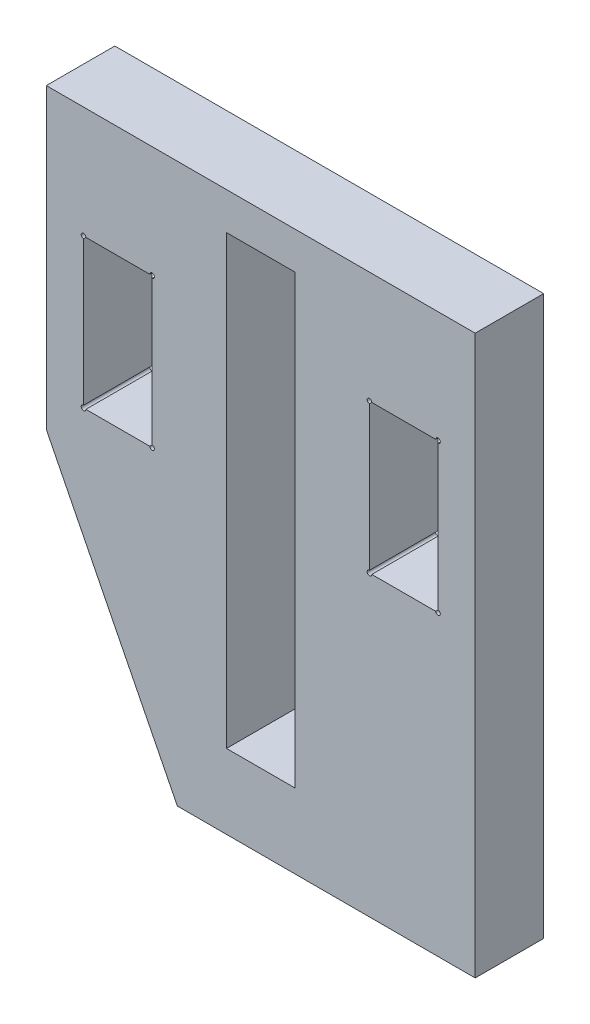
ISO-10303-21;
HEADER;
FILE_DESCRIPTION(('STEP AP214'),'2;1');
FILE_NAME('part.step','',(''),(''),'','','');
FILE_SCHEMA(('AUTOMOTIVE_DESIGN { 1 0 10303 214 1 1 1 1 }'));
ENDSEC;
DATA;
#1=APPLICATION_CONTEXT('core data for automotive mechanical design processes');
#2=APPLICATION_PROTOCOL_DEFINITION('international standard','automotive_design',2000,#1);
#3=PRODUCT_CONTEXT('',#1,'mechanical');
#4=PRODUCT('Part','Part','',(#3));
#5=PRODUCT_RELATED_PRODUCT_CATEGORY('part','',(#4));
#6=PRODUCT_DEFINITION_FORMATION('','',#4);
#7=PRODUCT_DEFINITION_CONTEXT('part definition',#1,'design');
#8=PRODUCT_DEFINITION('design','',#6,#7);
#9=PRODUCT_DEFINITION_SHAPE('','',#8);
#10=(LENGTH_UNIT() NAMED_UNIT(*) SI_UNIT(.MILLI.,.METRE.));
#11=(NAMED_UNIT(*) PLANE_ANGLE_UNIT() SI_UNIT($,.RADIAN.));
#12=(NAMED_UNIT(*) SI_UNIT($,.STERADIAN.) SOLID_ANGLE_UNIT());
#13=UNCERTAINTY_MEASURE_WITH_UNIT(LENGTH_MEASURE(1.E-05),#10,'distance_accuracy_value','');
#14=(GEOMETRIC_REPRESENTATION_CONTEXT(3) GLOBAL_UNCERTAINTY_ASSIGNED_CONTEXT((#13)) GLOBAL_UNIT_ASSIGNED_CONTEXT((#10,
#11,#12)) REPRESENTATION_CONTEXT('',''));
#15=CARTESIAN_POINT('',(0.,0.,0.));
#16=DIRECTION('',(0.,0.,1.));
#17=DIRECTION('',(1.,0.,0.));
#18=AXIS2_PLACEMENT_3D('',#15,#16,#17);
#19=CARTESIAN_POINT('',(0.,0.,5.842));
#20=DIRECTION('',(0.,0.,1.));
#21=DIRECTION('',(1.,0.,0.));
#22=AXIS2_PLACEMENT_3D('',#19,#20,#21);
#23=PLANE('',#22);
#24=CARTESIAN_POINT('',(24.384,12.7,5.842));
#25=DIRECTION('',(0.,0.,1.));
#26=DIRECTION('',(-1.,0.,0.));
#27=AXIS2_PLACEMENT_3D('',#24,#25,#26);
#28=CIRCLE('',#27,0.198437500000001);
#29=CARTESIAN_POINT('',(24.384,12.5015625,5.842));
#30=VERTEX_POINT('',#29);
#31=CARTESIAN_POINT('',(24.1855625,12.7,5.842));
#32=VERTEX_POINT('',#31);
#33=EDGE_CURVE('E47',#30,#32,#28,.T.);
#34=ORIENTED_EDGE('',*,*,#33,.F.);
#35=DIRECTION('',(0.,1.,0.));
#36=VECTOR('',#35,1.);
#37=CARTESIAN_POINT('',(24.384,12.7,5.842));
#38=LINE('',#37,#36);
#39=CARTESIAN_POINT('',(24.384,0.198437500000002,5.842));
#40=VERTEX_POINT('',#39);
#41=EDGE_CURVE('E213',#40,#30,#38,.T.);
#42=ORIENTED_EDGE('',*,*,#41,.F.);
#43=CARTESIAN_POINT('',(24.384,0.,5.842));
#44=DIRECTION('',(0.,0.,1.));
#45=DIRECTION('',(1.,0.,0.));
#46=AXIS2_PLACEMENT_3D('',#43,#44,#45);
#47=CIRCLE('',#46,0.198437499999998);
#48=CARTESIAN_POINT('',(24.1855625,0.,5.842));
#49=VERTEX_POINT('',#48);
#50=EDGE_CURVE('E355',#49,#40,#47,.T.);
#51=ORIENTED_EDGE('',*,*,#50,.F.);
#52=DIRECTION('',(1.,0.,0.));
#53=VECTOR('',#52,1.);
#54=CARTESIAN_POINT('',(18.542,0.,5.842));
#55=LINE('',#54,#53);
#56=CARTESIAN_POINT('',(18.7404375,0.,5.842));
#57=VERTEX_POINT('',#56);
#58=EDGE_CURVE('E220',#57,#49,#55,.T.);
#59=ORIENTED_EDGE('',*,*,#58,.F.);
#60=CARTESIAN_POINT('',(18.542,0.,5.842));
#61=DIRECTION('',(0.,0.,1.));
#62=DIRECTION('',(-1.,0.,0.));
#63=AXIS2_PLACEMENT_3D('',#60,#61,#62);
#64=CIRCLE('',#63,0.198437499999998);
#65=CARTESIAN_POINT('',(18.542,0.198437499999998,5.842));
#66=VERTEX_POINT('',#65);
#67=EDGE_CURVE('E347',#66,#57,#64,.T.);
#68=ORIENTED_EDGE('',*,*,#67,.F.);
#69=DIRECTION('',(0.,-1.,0.));
#70=VECTOR('',#69,1.);
#71=CARTESIAN_POINT('',(18.542,12.7,5.842));
#72=LINE('',#71,#70);
#73=CARTESIAN_POINT('',(18.542,12.5015625,5.842));
#74=VERTEX_POINT('',#73);
#75=EDGE_CURVE('E224',#74,#66,#72,.T.);
#76=ORIENTED_EDGE('',*,*,#75,.F.);
#77=CARTESIAN_POINT('',(18.542,12.7,5.842));
#78=DIRECTION('',(0.,0.,1.));
#79=DIRECTION('',(1.,0.,0.));
#80=AXIS2_PLACEMENT_3D('',#77,#78,#79);
#81=CIRCLE('',#80,0.198437500000001);
#82=CARTESIAN_POINT('',(18.7404375,12.7,5.842));
#83=VERTEX_POINT('',#82);
#84=EDGE_CURVE('E206',#83,#74,#81,.T.);
#85=ORIENTED_EDGE('',*,*,#84,.F.);
#86=DIRECTION('',(-1.,0.,0.));
#87=VECTOR('',#86,1.);
#88=CARTESIAN_POINT('',(18.542,12.7,5.842));
#89=LINE('',#88,#87);
#90=EDGE_CURVE('E215',#32,#83,#89,.T.);
#91=ORIENTED_EDGE('',*,*,#90,.F.);
#92=EDGE_LOOP('',(#34,#42,#51,#59,#68,#76,#85,#91));
#93=FACE_BOUND('',#92,.T.);
#94=CARTESIAN_POINT('',(-5.842,0.,5.842));
#95=DIRECTION('',(0.,0.,1.));
#96=DIRECTION('',(-1.,0.,0.));
#97=AXIS2_PLACEMENT_3D('',#94,#95,#96);
#98=CIRCLE('',#97,0.1984375);
#99=CARTESIAN_POINT('',(-5.842,0.1984375,5.842));
#100=VERTEX_POINT('',#99);
#101=CARTESIAN_POINT('',(-5.6435625,0.,5.842));
#102=VERTEX_POINT('',#101);
#103=EDGE_CURVE('E363',#100,#102,#98,.T.);
#104=ORIENTED_EDGE('',*,*,#103,.F.);
#105=DIRECTION('',(0.,-1.,0.));
#106=VECTOR('',#105,1.);
#107=CARTESIAN_POINT('',(-5.842,0.,5.842));
#108=LINE('',#107,#106);
#109=CARTESIAN_POINT('',(-5.842,12.5015625,5.842));
#110=VERTEX_POINT('',#109);
#111=EDGE_CURVE('E272',#110,#100,#108,.T.);
#112=ORIENTED_EDGE('',*,*,#111,.F.);
#113=CARTESIAN_POINT('',(-5.842,12.7,5.842));
#114=DIRECTION('',(0.,0.,1.));
#115=DIRECTION('',(1.,0.,0.));
#116=AXIS2_PLACEMENT_3D('',#113,#114,#115);
#117=CIRCLE('',#116,0.1984375);
#118=CARTESIAN_POINT('',(-5.6435625,12.7,5.842));
#119=VERTEX_POINT('',#118);
#120=EDGE_CURVE('E385',#119,#110,#117,.T.);
#121=ORIENTED_EDGE('',*,*,#120,.F.);
#122=DIRECTION('',(-1.,0.,0.));
#123=VECTOR('',#122,1.);
#124=CARTESIAN_POINT('',(0.,12.7,5.842));
#125=LINE('',#124,#123);
#126=CARTESIAN_POINT('',(-0.1984375,12.7,5.842));
#127=VERTEX_POINT('',#126);
#128=EDGE_CURVE('E269',#127,#119,#125,.T.);
#129=ORIENTED_EDGE('',*,*,#128,.F.);
#130=CARTESIAN_POINT('',(0.,12.7,5.842));
#131=DIRECTION('',(0.,0.,1.));
#132=DIRECTION('',(-1.,0.,0.));
#133=AXIS2_PLACEMENT_3D('',#130,#131,#132);
#134=CIRCLE('',#133,0.1984375);
#135=CARTESIAN_POINT('',(0.,12.5015625,5.842));
#136=VERTEX_POINT('',#135);
#137=EDGE_CURVE('E377',#136,#127,#134,.T.);
#138=ORIENTED_EDGE('',*,*,#137,.F.);
#139=DIRECTION('',(0.,1.,0.));
#140=VECTOR('',#139,1.);
#141=CARTESIAN_POINT('',(0.,0.,5.842));
#142=LINE('',#141,#140);
#143=CARTESIAN_POINT('',(0.,0.1984375,5.842));
#144=VERTEX_POINT('',#143);
#145=EDGE_CURVE('E267',#144,#136,#142,.T.);
#146=ORIENTED_EDGE('',*,*,#145,.F.);
#147=CARTESIAN_POINT('',(0.,0.,5.842));
#148=DIRECTION('',(0.,0.,1.));
#149=DIRECTION('',(1.,0.,0.));
#150=AXIS2_PLACEMENT_3D('',#147,#148,#149);
#151=CIRCLE('',#150,0.1984375);
#152=CARTESIAN_POINT('',(-0.1984375,0.,5.842));
#153=VERTEX_POINT('',#152);
#154=EDGE_CURVE('E370',#153,#144,#151,.T.);
#155=ORIENTED_EDGE('',*,*,#154,.F.);
#156=DIRECTION('',(1.,0.,0.));
#157=VECTOR('',#156,1.);
#158=CARTESIAN_POINT('',(0.,0.,5.842));
#159=LINE('',#158,#157);
#160=EDGE_CURVE('E275',#102,#153,#159,.T.);
#161=ORIENTED_EDGE('',*,*,#160,.F.);
#162=EDGE_LOOP('',(#104,#112,#121,#129,#138,#146,#155,#161));
#163=FACE_BOUND('',#162,.T.);
#164=DIRECTION('',(0.,-1.,0.));
#165=VECTOR('',#164,1.);
#166=CARTESIAN_POINT('',(-9.017,22.225,5.842));
#167=LINE('',#166,#165);
#168=CARTESIAN_POINT('',(-9.017,22.225,5.842));
#169=VERTEX_POINT('',#168);
#170=CARTESIAN_POINT('',(-9.017,-3.175,5.842));
#171=VERTEX_POINT('',#170);
#172=EDGE_CURVE('E285',#169,#171,#167,.T.);
#173=ORIENTED_EDGE('',*,*,#172,.T.);
#174=DIRECTION('',(0.449254495828886,-0.893403826932443,0.));
#175=VECTOR('',#174,1.);
#176=CARTESIAN_POINT('',(2.15900000000001,-25.4,5.842));
#177=LINE('',#176,#175);
#178=CARTESIAN_POINT('',(2.15900000000001,-25.4,5.842));
#179=VERTEX_POINT('',#178);
#180=EDGE_CURVE('E288',#171,#179,#177,.T.);
#181=ORIENTED_EDGE('',*,*,#180,.T.);
#182=DIRECTION('',(1.,0.,0.));
#183=VECTOR('',#182,1.);
#184=CARTESIAN_POINT('',(2.15900000000001,-25.4,5.842));
#185=LINE('',#184,#183);
#186=CARTESIAN_POINT('',(27.559,-25.4,5.842));
#187=VERTEX_POINT('',#186);
#188=EDGE_CURVE('E291',#179,#187,#185,.T.);
#189=ORIENTED_EDGE('',*,*,#188,.T.);
#190=DIRECTION('',(0.,1.,0.));
#191=VECTOR('',#190,1.);
#192=CARTESIAN_POINT('',(27.559,22.225,5.842));
#193=LINE('',#192,#191);
#194=CARTESIAN_POINT('',(27.559,22.225,5.842));
#195=VERTEX_POINT('',#194);
#196=EDGE_CURVE('E293',#187,#195,#193,.T.);
#197=ORIENTED_EDGE('',*,*,#196,.T.);
#198=DIRECTION('',(-1.,0.,0.));
#199=VECTOR('',#198,1.);
#200=CARTESIAN_POINT('',(12.192,22.225,5.842));
#201=LINE('',#200,#199);
#202=EDGE_CURVE('E295',#195,#169,#201,.T.);
#203=ORIENTED_EDGE('',*,*,#202,.T.);
#204=EDGE_LOOP('',(#173,#181,#189,#197,#203));
#205=FACE_BOUND('',#204,.T.);
#206=DIRECTION('',(0.,-1.,0.));
#207=VECTOR('',#206,1.);
#208=CARTESIAN_POINT('',(6.35,19.05,5.842));
#209=LINE('',#208,#207);
#210=CARTESIAN_POINT('',(6.35,19.05,5.842));
#211=VERTEX_POINT('',#210);
#212=CARTESIAN_POINT('',(6.35,-19.05,5.842));
#213=VERTEX_POINT('',#212);
#214=EDGE_CURVE('E241',#211,#213,#209,.T.);
#215=ORIENTED_EDGE('',*,*,#214,.F.);
#216=DIRECTION('',(-1.,0.,0.));
#217=VECTOR('',#216,1.);
#218=CARTESIAN_POINT('',(6.35,19.05,5.842));
#219=LINE('',#218,#217);
#220=CARTESIAN_POINT('',(12.192,19.05,5.842));
#221=VERTEX_POINT('',#220);
#222=EDGE_CURVE('E238',#221,#211,#219,.T.);
#223=ORIENTED_EDGE('',*,*,#222,.F.);
#224=DIRECTION('',(0.,1.,0.));
#225=VECTOR('',#224,1.);
#226=CARTESIAN_POINT('',(12.192,0.,5.842));
#227=LINE('',#226,#225);
#228=CARTESIAN_POINT('',(12.192,-19.05,5.842));
#229=VERTEX_POINT('',#228);
#230=EDGE_CURVE('E236',#229,#221,#227,.T.);
#231=ORIENTED_EDGE('',*,*,#230,.F.);
#232=DIRECTION('',(1.,0.,0.));
#233=VECTOR('',#232,1.);
#234=CARTESIAN_POINT('',(6.35,-19.05,5.842));
#235=LINE('',#234,#233);
#236=EDGE_CURVE('E243',#213,#229,#235,.T.);
#237=ORIENTED_EDGE('',*,*,#236,.F.);
#238=EDGE_LOOP('',(#215,#223,#231,#237));
#239=FACE_BOUND('',#238,.T.);
#240=ADVANCED_FACE('F33',(#93,#163,#205,#239),#23,.T.);
#241=CARTESIAN_POINT('',(0.,0.,0.));
#242=DIRECTION('',(0.,0.,1.));
#243=DIRECTION('',(1.,0.,0.));
#244=AXIS2_PLACEMENT_3D('',#241,#242,#243);
#245=PLANE('',#244);
#246=DIRECTION('',(-1.,0.,0.));
#247=VECTOR('',#246,1.);
#248=CARTESIAN_POINT('',(6.35,19.05,0.));
#249=LINE('',#248,#247);
#250=CARTESIAN_POINT('',(12.192,19.05,0.));
#251=VERTEX_POINT('',#250);
#252=CARTESIAN_POINT('',(6.35,19.05,0.));
#253=VERTEX_POINT('',#252);
#254=EDGE_CURVE('E222',#251,#253,#249,.T.);
#255=ORIENTED_EDGE('',*,*,#254,.T.);
#256=DIRECTION('',(0.,-1.,0.));
#257=VECTOR('',#256,1.);
#258=CARTESIAN_POINT('',(6.35,-12.7,0.));
#259=LINE('',#258,#257);
#260=CARTESIAN_POINT('',(6.35,-19.05,0.));
#261=VERTEX_POINT('',#260);
#262=EDGE_CURVE('E249',#253,#261,#259,.T.);
#263=ORIENTED_EDGE('',*,*,#262,.T.);
#264=DIRECTION('',(1.,0.,0.));
#265=VECTOR('',#264,1.);
#266=CARTESIAN_POINT('',(6.35,-19.05,0.));
#267=LINE('',#266,#265);
#268=CARTESIAN_POINT('',(12.192,-19.05,0.));
#269=VERTEX_POINT('',#268);
#270=EDGE_CURVE('E252',#261,#269,#267,.T.);
#271=ORIENTED_EDGE('',*,*,#270,.T.);
#272=DIRECTION('',(0.,1.,0.));
#273=VECTOR('',#272,1.);
#274=CARTESIAN_POINT('',(12.192,0.,0.));
#275=LINE('',#274,#273);
#276=EDGE_CURVE('E239',#269,#251,#275,.T.);
#277=ORIENTED_EDGE('',*,*,#276,.T.);
#278=EDGE_LOOP('',(#255,#263,#271,#277));
#279=FACE_BOUND('',#278,.T.);
#280=DIRECTION('',(0.,-1.,0.));
#281=VECTOR('',#280,1.);
#282=CARTESIAN_POINT('',(-9.017,22.225,0.));
#283=LINE('',#282,#281);
#284=CARTESIAN_POINT('',(-9.017,22.225,0.));
#285=VERTEX_POINT('',#284);
#286=CARTESIAN_POINT('',(-9.017,-3.175,0.));
#287=VERTEX_POINT('',#286);
#288=EDGE_CURVE('E277',#285,#287,#283,.T.);
#289=ORIENTED_EDGE('',*,*,#288,.F.);
#290=DIRECTION('',(-1.,0.,0.));
#291=VECTOR('',#290,1.);
#292=CARTESIAN_POINT('',(-9.017,22.225,0.));
#293=LINE('',#292,#291);
#294=CARTESIAN_POINT('',(27.559,22.225,0.));
#295=VERTEX_POINT('',#294);
#296=EDGE_CURVE('E289',#295,#285,#293,.T.);
#297=ORIENTED_EDGE('',*,*,#296,.F.);
#298=DIRECTION('',(0.,1.,0.));
#299=VECTOR('',#298,1.);
#300=CARTESIAN_POINT('',(27.559,22.225,0.));
#301=LINE('',#300,#299);
#302=CARTESIAN_POINT('',(27.559,-25.4,0.));
#303=VERTEX_POINT('',#302);
#304=EDGE_CURVE('E304',#303,#295,#301,.T.);
#305=ORIENTED_EDGE('',*,*,#304,.F.);
#306=DIRECTION('',(1.,0.,0.));
#307=VECTOR('',#306,1.);
#308=CARTESIAN_POINT('',(2.15900000000001,-25.4,0.));
#309=LINE('',#308,#307);
#310=CARTESIAN_POINT('',(2.15900000000001,-25.4,0.));
#311=VERTEX_POINT('',#310);
#312=EDGE_CURVE('E302',#311,#303,#309,.T.);
#313=ORIENTED_EDGE('',*,*,#312,.F.);
#314=DIRECTION('',(0.449254495828886,-0.893403826932443,0.));
#315=VECTOR('',#314,1.);
#316=CARTESIAN_POINT('',(2.15900000000001,-25.4,0.));
#317=LINE('',#316,#315);
#318=EDGE_CURVE('E300',#287,#311,#317,.T.);
#319=ORIENTED_EDGE('',*,*,#318,.F.);
#320=EDGE_LOOP('',(#289,#297,#305,#313,#319));
#321=FACE_BOUND('',#320,.T.);
#322=DIRECTION('',(0.,-1.,0.));
#323=VECTOR('',#322,1.);
#324=CARTESIAN_POINT('',(-5.842,0.,0.));
#325=LINE('',#324,#323);
#326=CARTESIAN_POINT('',(-5.842,12.5015625,0.));
#327=VERTEX_POINT('',#326);
#328=CARTESIAN_POINT('',(-5.842,0.1984375,0.));
#329=VERTEX_POINT('',#328);
#330=EDGE_CURVE('E281',#327,#329,#325,.T.);
#331=ORIENTED_EDGE('',*,*,#330,.T.);
#332=CARTESIAN_POINT('',(-5.842,0.,0.));
#333=DIRECTION('',(0.,0.,1.));
#334=DIRECTION('',(-1.,0.,0.));
#335=AXIS2_PLACEMENT_3D('',#332,#333,#334);
#336=CIRCLE('',#335,0.1984375);
#337=CARTESIAN_POINT('',(-5.6435625,0.,0.));
#338=VERTEX_POINT('',#337);
#339=EDGE_CURVE('E364',#329,#338,#336,.T.);
#340=ORIENTED_EDGE('',*,*,#339,.T.);
#341=DIRECTION('',(1.,0.,0.));
#342=VECTOR('',#341,1.);
#343=CARTESIAN_POINT('',(0.,0.,0.));
#344=LINE('',#343,#342);
#345=CARTESIAN_POINT('',(-0.1984375,0.,0.));
#346=VERTEX_POINT('',#345);
#347=EDGE_CURVE('E270',#338,#346,#344,.T.);
#348=ORIENTED_EDGE('',*,*,#347,.T.);
#349=CARTESIAN_POINT('',(0.,0.,0.));
#350=DIRECTION('',(0.,0.,1.));
#351=DIRECTION('',(1.,0.,0.));
#352=AXIS2_PLACEMENT_3D('',#349,#350,#351);
#353=CIRCLE('',#352,0.1984375);
#354=CARTESIAN_POINT('',(0.,0.1984375,0.));
#355=VERTEX_POINT('',#354);
#356=EDGE_CURVE('E371',#346,#355,#353,.T.);
#357=ORIENTED_EDGE('',*,*,#356,.T.);
#358=DIRECTION('',(0.,1.,0.));
#359=VECTOR('',#358,1.);
#360=CARTESIAN_POINT('',(0.,0.,0.));
#361=LINE('',#360,#359);
#362=CARTESIAN_POINT('',(0.,12.5015625,0.));
#363=VERTEX_POINT('',#362);
#364=EDGE_CURVE('E266',#355,#363,#361,.T.);
#365=ORIENTED_EDGE('',*,*,#364,.T.);
#366=CARTESIAN_POINT('',(0.,12.7,0.));
#367=DIRECTION('',(0.,0.,1.));
#368=DIRECTION('',(-1.,0.,0.));
#369=AXIS2_PLACEMENT_3D('',#366,#367,#368);
#370=CIRCLE('',#369,0.1984375);
#371=CARTESIAN_POINT('',(-0.1984375,12.7,0.));
#372=VERTEX_POINT('',#371);
#373=EDGE_CURVE('E378',#363,#372,#370,.T.);
#374=ORIENTED_EDGE('',*,*,#373,.T.);
#375=DIRECTION('',(-1.,0.,0.));
#376=VECTOR('',#375,1.);
#377=CARTESIAN_POINT('',(0.,12.7,0.));
#378=LINE('',#377,#376);
#379=CARTESIAN_POINT('',(-5.6435625,12.7,0.));
#380=VERTEX_POINT('',#379);
#381=EDGE_CURVE('E279',#372,#380,#378,.T.);
#382=ORIENTED_EDGE('',*,*,#381,.T.);
#383=CARTESIAN_POINT('',(-5.842,12.7,0.));
#384=DIRECTION('',(0.,0.,1.));
#385=DIRECTION('',(1.,0.,0.));
#386=AXIS2_PLACEMENT_3D('',#383,#384,#385);
#387=CIRCLE('',#386,0.1984375);
#388=EDGE_CURVE('E386',#380,#327,#387,.T.);
#389=ORIENTED_EDGE('',*,*,#388,.T.);
#390=EDGE_LOOP('',(#331,#340,#348,#357,#365,#374,#382,#389));
#391=FACE_BOUND('',#390,.T.);
#392=DIRECTION('',(0.,1.,0.));
#393=VECTOR('',#392,1.);
#394=CARTESIAN_POINT('',(24.384,12.7,0.));
#395=LINE('',#394,#393);
#396=CARTESIAN_POINT('',(24.384,0.198437499999998,0.));
#397=VERTEX_POINT('',#396);
#398=CARTESIAN_POINT('',(24.384,12.5015625,0.));
#399=VERTEX_POINT('',#398);
#400=EDGE_CURVE('E233',#397,#399,#395,.T.);
#401=ORIENTED_EDGE('',*,*,#400,.T.);
#402=CARTESIAN_POINT('',(24.384,12.7,0.));
#403=DIRECTION('',(0.,0.,1.));
#404=DIRECTION('',(-1.,0.,0.));
#405=AXIS2_PLACEMENT_3D('',#402,#403,#404);
#406=CIRCLE('',#405,0.198437500000001);
#407=CARTESIAN_POINT('',(24.1855625,12.7,0.));
#408=VERTEX_POINT('',#407);
#409=EDGE_CURVE('E201',#399,#408,#406,.T.);
#410=ORIENTED_EDGE('',*,*,#409,.T.);
#411=DIRECTION('',(-1.,0.,0.));
#412=VECTOR('',#411,1.);
#413=CARTESIAN_POINT('',(18.542,12.7,0.));
#414=LINE('',#413,#412);
#415=CARTESIAN_POINT('',(18.7404375,12.7,0.));
#416=VERTEX_POINT('',#415);
#417=EDGE_CURVE('E55',#408,#416,#414,.T.);
#418=ORIENTED_EDGE('',*,*,#417,.T.);
#419=CARTESIAN_POINT('',(18.542,12.7,0.));
#420=DIRECTION('',(0.,0.,1.));
#421=DIRECTION('',(1.,0.,0.));
#422=AXIS2_PLACEMENT_3D('',#419,#420,#421);
#423=CIRCLE('',#422,0.198437500000001);
#424=CARTESIAN_POINT('',(18.542,12.5015625,0.));
#425=VERTEX_POINT('',#424);
#426=EDGE_CURVE('E338',#416,#425,#423,.T.);
#427=ORIENTED_EDGE('',*,*,#426,.T.);
#428=DIRECTION('',(0.,-1.,0.));
#429=VECTOR('',#428,1.);
#430=CARTESIAN_POINT('',(18.542,12.7,0.));
#431=LINE('',#430,#429);
#432=CARTESIAN_POINT('',(18.542,0.198437499999998,0.));
#433=VERTEX_POINT('',#432);
#434=EDGE_CURVE('E228',#425,#433,#431,.T.);
#435=ORIENTED_EDGE('',*,*,#434,.T.);
#436=CARTESIAN_POINT('',(18.542,0.,0.));
#437=DIRECTION('',(0.,0.,1.));
#438=DIRECTION('',(-1.,0.,0.));
#439=AXIS2_PLACEMENT_3D('',#436,#437,#438);
#440=CIRCLE('',#439,0.198437499999998);
#441=CARTESIAN_POINT('',(18.7404375,0.,0.));
#442=VERTEX_POINT('',#441);
#443=EDGE_CURVE('E348',#433,#442,#440,.T.);
#444=ORIENTED_EDGE('',*,*,#443,.T.);
#445=DIRECTION('',(1.,0.,0.));
#446=VECTOR('',#445,1.);
#447=CARTESIAN_POINT('',(18.542,0.,0.));
#448=LINE('',#447,#446);
#449=CARTESIAN_POINT('',(24.1855625,0.,0.));
#450=VERTEX_POINT('',#449);
#451=EDGE_CURVE('E230',#442,#450,#448,.T.);
#452=ORIENTED_EDGE('',*,*,#451,.T.);
#453=CARTESIAN_POINT('',(24.384,0.,0.));
#454=DIRECTION('',(0.,0.,1.));
#455=DIRECTION('',(1.,0.,0.));
#456=AXIS2_PLACEMENT_3D('',#453,#454,#455);
#457=CIRCLE('',#456,0.198437499999998);
#458=EDGE_CURVE('E356',#450,#397,#457,.T.);
#459=ORIENTED_EDGE('',*,*,#458,.T.);
#460=EDGE_LOOP('',(#401,#410,#418,#427,#435,#444,#452,#459));
#461=FACE_BOUND('',#460,.T.);
#462=ADVANCED_FACE('F407',(#279,#321,#391,#461),#245,.F.);
#463=CARTESIAN_POINT('',(-9.017,22.225,5.842));
#464=DIRECTION('',(1.,0.,0.));
#465=DIRECTION('',(0.,1.,0.));
#466=AXIS2_PLACEMENT_3D('',#463,#464,#465);
#467=PLANE('',#466);
#468=ORIENTED_EDGE('',*,*,#288,.T.);
#469=DIRECTION('',(0.,0.,-1.));
#470=VECTOR('',#469,1.);
#471=CARTESIAN_POINT('',(-9.017,-3.175,5.842));
#472=LINE('',#471,#470);
#473=EDGE_CURVE('E319',#171,#287,#472,.T.);
#474=ORIENTED_EDGE('',*,*,#473,.F.);
#475=ORIENTED_EDGE('',*,*,#172,.F.);
#476=DIRECTION('',(0.,0.,-1.));
#477=VECTOR('',#476,1.);
#478=CARTESIAN_POINT('',(-9.017,22.225,5.842));
#479=LINE('',#478,#477);
#480=EDGE_CURVE('E297',#169,#285,#479,.T.);
#481=ORIENTED_EDGE('',*,*,#480,.T.);
#482=EDGE_LOOP('',(#468,#474,#475,#481));
#483=FACE_BOUND('',#482,.T.);
#484=ADVANCED_FACE('F35',(#483),#467,.F.);
#485=CARTESIAN_POINT('',(2.15900000000001,-25.4,5.842));
#486=DIRECTION('',(0.893403826932443,0.449254495828886,0.));
#487=DIRECTION('',(-0.449254495828886,0.893403826932443,0.));
#488=AXIS2_PLACEMENT_3D('',#485,#486,#487);
#489=PLANE('',#488);
#490=ORIENTED_EDGE('',*,*,#318,.T.);
#491=DIRECTION('',(0.,0.,-1.));
#492=VECTOR('',#491,1.);
#493=CARTESIAN_POINT('',(2.15900000000001,-25.4,5.842));
#494=LINE('',#493,#492);
#495=EDGE_CURVE('E316',#179,#311,#494,.T.);
#496=ORIENTED_EDGE('',*,*,#495,.F.);
#497=ORIENTED_EDGE('',*,*,#180,.F.);
#498=ORIENTED_EDGE('',*,*,#473,.T.);
#499=EDGE_LOOP('',(#490,#496,#497,#498));
#500=FACE_BOUND('',#499,.T.);
#501=ADVANCED_FACE('F442',(#500),#489,.F.);
#502=CARTESIAN_POINT('',(2.15900000000001,-25.4,5.842));
#503=DIRECTION('',(0.,1.,0.));
#504=DIRECTION('',(-1.,0.,0.));
#505=AXIS2_PLACEMENT_3D('',#502,#503,#504);
#506=PLANE('',#505);
#507=ORIENTED_EDGE('',*,*,#312,.T.);
#508=DIRECTION('',(0.,0.,-1.));
#509=VECTOR('',#508,1.);
#510=CARTESIAN_POINT('',(27.559,-25.4,5.842));
#511=LINE('',#510,#509);
#512=EDGE_CURVE('E313',#187,#303,#511,.T.);
#513=ORIENTED_EDGE('',*,*,#512,.F.);
#514=ORIENTED_EDGE('',*,*,#188,.F.);
#515=ORIENTED_EDGE('',*,*,#495,.T.);
#516=EDGE_LOOP('',(#507,#513,#514,#515));
#517=FACE_BOUND('',#516,.T.);
#518=ADVANCED_FACE('F439',(#517),#506,.F.);
#519=CARTESIAN_POINT('',(27.559,22.225,5.842));
#520=DIRECTION('',(-1.,0.,0.));
#521=DIRECTION('',(0.,-1.,0.));
#522=AXIS2_PLACEMENT_3D('',#519,#520,#521);
#523=PLANE('',#522);
#524=ORIENTED_EDGE('',*,*,#304,.T.);
#525=DIRECTION('',(0.,0.,-1.));
#526=VECTOR('',#525,1.);
#527=CARTESIAN_POINT('',(27.559,22.225,5.842));
#528=LINE('',#527,#526);
#529=EDGE_CURVE('E310',#195,#295,#528,.T.);
#530=ORIENTED_EDGE('',*,*,#529,.F.);
#531=ORIENTED_EDGE('',*,*,#196,.F.);
#532=ORIENTED_EDGE('',*,*,#512,.T.);
#533=EDGE_LOOP('',(#524,#530,#531,#532));
#534=FACE_BOUND('',#533,.T.);
#535=ADVANCED_FACE('F435',(#534),#523,.F.);
#536=CARTESIAN_POINT('',(-9.017,22.225,5.842));
#537=DIRECTION('',(0.,-1.,0.));
#538=DIRECTION('',(0.,0.,-1.));
#539=AXIS2_PLACEMENT_3D('',#536,#537,#538);
#540=PLANE('',#539);
#541=ORIENTED_EDGE('',*,*,#296,.T.);
#542=ORIENTED_EDGE('',*,*,#480,.F.);
#543=ORIENTED_EDGE('',*,*,#202,.F.);
#544=ORIENTED_EDGE('',*,*,#529,.T.);
#545=EDGE_LOOP('',(#541,#542,#543,#544));
#546=FACE_BOUND('',#545,.T.);
#547=ADVANCED_FACE('F432',(#546),#540,.F.);
#548=CARTESIAN_POINT('',(0.,0.,5.842));
#549=DIRECTION('',(-1.,0.,0.));
#550=DIRECTION('',(0.,0.,1.));
#551=AXIS2_PLACEMENT_3D('',#548,#549,#550);
#552=PLANE('',#551);
#553=DIRECTION('',(0.,0.,1.));
#554=VECTOR('',#553,1.);
#555=CARTESIAN_POINT('',(0.,0.1984375,0.));
#556=LINE('',#555,#554);
#557=EDGE_CURVE('E374',#144,#355,#556,.F.);
#558=ORIENTED_EDGE('',*,*,#557,.F.);
#559=ORIENTED_EDGE('',*,*,#145,.T.);
#560=DIRECTION('',(0.,0.,1.));
#561=VECTOR('',#560,1.);
#562=CARTESIAN_POINT('',(0.,12.5015625,0.));
#563=LINE('',#562,#561);
#564=EDGE_CURVE('E381',#363,#136,#563,.T.);
#565=ORIENTED_EDGE('',*,*,#564,.F.);
#566=ORIENTED_EDGE('',*,*,#364,.F.);
#567=EDGE_LOOP('',(#558,#559,#565,#566));
#568=FACE_BOUND('',#567,.T.);
#569=ADVANCED_FACE('F429',(#568),#552,.T.);
#570=CARTESIAN_POINT('',(0.,12.7,5.842));
#571=DIRECTION('',(0.,-1.,0.));
#572=DIRECTION('',(0.,0.,-1.));
#573=AXIS2_PLACEMENT_3D('',#570,#571,#572);
#574=PLANE('',#573);
#575=DIRECTION('',(0.,0.,1.));
#576=VECTOR('',#575,1.);
#577=CARTESIAN_POINT('',(-0.1984375,12.7,0.));
#578=LINE('',#577,#576);
#579=EDGE_CURVE('E324',#127,#372,#578,.F.);
#580=ORIENTED_EDGE('',*,*,#579,.F.);
#581=ORIENTED_EDGE('',*,*,#128,.T.);
#582=DIRECTION('',(0.,0.,1.));
#583=VECTOR('',#582,1.);
#584=CARTESIAN_POINT('',(-5.6435625,12.7,0.));
#585=LINE('',#584,#583);
#586=EDGE_CURVE('E231',#380,#119,#585,.T.);
#587=ORIENTED_EDGE('',*,*,#586,.F.);
#588=ORIENTED_EDGE('',*,*,#381,.F.);
#589=EDGE_LOOP('',(#580,#581,#587,#588));
#590=FACE_BOUND('',#589,.T.);
#591=ADVANCED_FACE('F503',(#590),#574,.T.);
#592=CARTESIAN_POINT('',(-5.842,0.,5.842));
#593=DIRECTION('',(1.,0.,0.));
#594=DIRECTION('',(0.,0.,-1.));
#595=AXIS2_PLACEMENT_3D('',#592,#593,#594);
#596=PLANE('',#595);
#597=DIRECTION('',(0.,0.,1.));
#598=VECTOR('',#597,1.);
#599=CARTESIAN_POINT('',(-5.842,0.1984375,0.));
#600=LINE('',#599,#598);
#601=EDGE_CURVE('E367',#329,#100,#600,.T.);
#602=ORIENTED_EDGE('',*,*,#601,.F.);
#603=ORIENTED_EDGE('',*,*,#330,.F.);
#604=DIRECTION('',(0.,0.,1.));
#605=VECTOR('',#604,1.);
#606=CARTESIAN_POINT('',(-5.842,12.5015625,0.));
#607=LINE('',#606,#605);
#608=EDGE_CURVE('E322',#110,#327,#607,.F.);
#609=ORIENTED_EDGE('',*,*,#608,.F.);
#610=ORIENTED_EDGE('',*,*,#111,.T.);
#611=EDGE_LOOP('',(#602,#603,#609,#610));
#612=FACE_BOUND('',#611,.T.);
#613=ADVANCED_FACE('F500',(#612),#596,.T.);
#614=CARTESIAN_POINT('',(0.,0.,5.842));
#615=DIRECTION('',(0.,1.,0.));
#616=DIRECTION('',(0.,0.,1.));
#617=AXIS2_PLACEMENT_3D('',#614,#615,#616);
#618=PLANE('',#617);
#619=DIRECTION('',(0.,0.,1.));
#620=VECTOR('',#619,1.);
#621=CARTESIAN_POINT('',(-5.6435625,0.,0.));
#622=LINE('',#621,#620);
#623=EDGE_CURVE('E329',#102,#338,#622,.F.);
#624=ORIENTED_EDGE('',*,*,#623,.F.);
#625=ORIENTED_EDGE('',*,*,#160,.T.);
#626=DIRECTION('',(0.,0.,1.));
#627=VECTOR('',#626,1.);
#628=CARTESIAN_POINT('',(-0.1984375,0.,0.));
#629=LINE('',#628,#627);
#630=EDGE_CURVE('E326',#346,#153,#629,.T.);
#631=ORIENTED_EDGE('',*,*,#630,.F.);
#632=ORIENTED_EDGE('',*,*,#347,.F.);
#633=EDGE_LOOP('',(#624,#625,#631,#632));
#634=FACE_BOUND('',#633,.T.);
#635=ADVANCED_FACE('F497',(#634),#618,.T.);
#636=CARTESIAN_POINT('',(6.35,19.05,5.842));
#637=DIRECTION('',(0.,-1.,0.));
#638=DIRECTION('',(0.,0.,-1.));
#639=AXIS2_PLACEMENT_3D('',#636,#637,#638);
#640=PLANE('',#639);
#641=ORIENTED_EDGE('',*,*,#254,.F.);
#642=DIRECTION('',(0.,0.,-1.));
#643=VECTOR('',#642,1.);
#644=CARTESIAN_POINT('',(12.192,19.05,5.842));
#645=LINE('',#644,#643);
#646=EDGE_CURVE('E264',#221,#251,#645,.T.);
#647=ORIENTED_EDGE('',*,*,#646,.F.);
#648=ORIENTED_EDGE('',*,*,#222,.T.);
#649=DIRECTION('',(0.,0.,-1.));
#650=VECTOR('',#649,1.);
#651=CARTESIAN_POINT('',(6.35,19.05,5.842));
#652=LINE('',#651,#650);
#653=EDGE_CURVE('E261',#211,#253,#652,.T.);
#654=ORIENTED_EDGE('',*,*,#653,.T.);
#655=EDGE_LOOP('',(#641,#647,#648,#654));
#656=FACE_BOUND('',#655,.T.);
#657=ADVANCED_FACE('F479',(#656),#640,.T.);
#658=CARTESIAN_POINT('',(6.35,-12.7,5.842));
#659=DIRECTION('',(1.,0.,0.));
#660=DIRECTION('',(0.,1.,0.));
#661=AXIS2_PLACEMENT_3D('',#658,#659,#660);
#662=PLANE('',#661);
#663=ORIENTED_EDGE('',*,*,#262,.F.);
#664=ORIENTED_EDGE('',*,*,#653,.F.);
#665=ORIENTED_EDGE('',*,*,#214,.T.);
#666=DIRECTION('',(0.,0.,-1.));
#667=VECTOR('',#666,1.);
#668=CARTESIAN_POINT('',(6.35,-19.05,5.842));
#669=LINE('',#668,#667);
#670=EDGE_CURVE('E259',#213,#261,#669,.T.);
#671=ORIENTED_EDGE('',*,*,#670,.T.);
#672=EDGE_LOOP('',(#663,#664,#665,#671));
#673=FACE_BOUND('',#672,.T.);
#674=ADVANCED_FACE('F473',(#673),#662,.T.);
#675=CARTESIAN_POINT('',(6.35,-19.05,5.842));
#676=DIRECTION('',(0.,1.,0.));
#677=DIRECTION('',(0.,0.,1.));
#678=AXIS2_PLACEMENT_3D('',#675,#676,#677);
#679=PLANE('',#678);
#680=ORIENTED_EDGE('',*,*,#270,.F.);
#681=ORIENTED_EDGE('',*,*,#670,.F.);
#682=ORIENTED_EDGE('',*,*,#236,.T.);
#683=DIRECTION('',(0.,0.,-1.));
#684=VECTOR('',#683,1.);
#685=CARTESIAN_POINT('',(12.192,-19.05,5.842));
#686=LINE('',#685,#684);
#687=EDGE_CURVE('E246',#229,#269,#686,.T.);
#688=ORIENTED_EDGE('',*,*,#687,.T.);
#689=EDGE_LOOP('',(#680,#681,#682,#688));
#690=FACE_BOUND('',#689,.T.);
#691=ADVANCED_FACE('F476',(#690),#679,.T.);
#692=CARTESIAN_POINT('',(12.192,0.,5.842));
#693=DIRECTION('',(-1.,0.,0.));
#694=DIRECTION('',(0.,-1.,0.));
#695=AXIS2_PLACEMENT_3D('',#692,#693,#694);
#696=PLANE('',#695);
#697=ORIENTED_EDGE('',*,*,#276,.F.);
#698=ORIENTED_EDGE('',*,*,#687,.F.);
#699=ORIENTED_EDGE('',*,*,#230,.T.);
#700=ORIENTED_EDGE('',*,*,#646,.T.);
#701=EDGE_LOOP('',(#697,#698,#699,#700));
#702=FACE_BOUND('',#701,.T.);
#703=ADVANCED_FACE('F482',(#702),#696,.T.);
#704=CARTESIAN_POINT('',(18.542,12.7,5.842));
#705=DIRECTION('',(1.,0.,0.));
#706=DIRECTION('',(0.,1.,0.));
#707=AXIS2_PLACEMENT_3D('',#704,#705,#706);
#708=PLANE('',#707);
#709=DIRECTION('',(0.,0.,1.));
#710=VECTOR('',#709,1.);
#711=CARTESIAN_POINT('',(18.542,12.5015625,0.));
#712=LINE('',#711,#710);
#713=EDGE_CURVE('E343',#74,#425,#712,.F.);
#714=ORIENTED_EDGE('',*,*,#713,.F.);
#715=ORIENTED_EDGE('',*,*,#75,.T.);
#716=DIRECTION('',(0.,0.,1.));
#717=VECTOR('',#716,1.);
#718=CARTESIAN_POINT('',(18.542,0.198437499999998,0.));
#719=LINE('',#718,#717);
#720=EDGE_CURVE('E351',#433,#66,#719,.T.);
#721=ORIENTED_EDGE('',*,*,#720,.F.);
#722=ORIENTED_EDGE('',*,*,#434,.F.);
#723=EDGE_LOOP('',(#714,#715,#721,#722));
#724=FACE_BOUND('',#723,.T.);
#725=ADVANCED_FACE('F393',(#724),#708,.T.);
#726=CARTESIAN_POINT('',(18.542,0.,5.842));
#727=DIRECTION('',(0.,1.,0.));
#728=DIRECTION('',(-1.,0.,0.));
#729=AXIS2_PLACEMENT_3D('',#726,#727,#728);
#730=PLANE('',#729);
#731=DIRECTION('',(0.,0.,1.));
#732=VECTOR('',#731,1.);
#733=CARTESIAN_POINT('',(18.7404375,0.,0.));
#734=LINE('',#733,#732);
#735=EDGE_CURVE('E332',#57,#442,#734,.F.);
#736=ORIENTED_EDGE('',*,*,#735,.F.);
#737=ORIENTED_EDGE('',*,*,#58,.T.);
#738=DIRECTION('',(0.,0.,1.));
#739=VECTOR('',#738,1.);
#740=CARTESIAN_POINT('',(24.1855625,0.,0.));
#741=LINE('',#740,#739);
#742=EDGE_CURVE('E359',#450,#49,#741,.T.);
#743=ORIENTED_EDGE('',*,*,#742,.F.);
#744=ORIENTED_EDGE('',*,*,#451,.F.);
#745=EDGE_LOOP('',(#736,#737,#743,#744));
#746=FACE_BOUND('',#745,.T.);
#747=ADVANCED_FACE('F402',(#746),#730,.T.);
#748=CARTESIAN_POINT('',(24.384,12.7,5.842));
#749=DIRECTION('',(-1.,0.,0.));
#750=DIRECTION('',(0.,0.,1.));
#751=AXIS2_PLACEMENT_3D('',#748,#749,#750);
#752=PLANE('',#751);
#753=DIRECTION('',(0.,0.,1.));
#754=VECTOR('',#753,1.);
#755=CARTESIAN_POINT('',(24.384,12.5015625,0.));
#756=LINE('',#755,#754);
#757=EDGE_CURVE('E199',#399,#30,#756,.T.);
#758=ORIENTED_EDGE('',*,*,#757,.F.);
#759=ORIENTED_EDGE('',*,*,#400,.F.);
#760=DIRECTION('',(0.,0.,1.));
#761=VECTOR('',#760,1.);
#762=CARTESIAN_POINT('',(24.384,0.198437499999998,0.));
#763=LINE('',#762,#761);
#764=EDGE_CURVE('E219',#40,#397,#763,.F.);
#765=ORIENTED_EDGE('',*,*,#764,.F.);
#766=ORIENTED_EDGE('',*,*,#41,.T.);
#767=EDGE_LOOP('',(#758,#759,#765,#766));
#768=FACE_BOUND('',#767,.T.);
#769=ADVANCED_FACE('F218',(#768),#752,.T.);
#770=CARTESIAN_POINT('',(18.542,12.7,5.842));
#771=DIRECTION('',(0.,-1.,0.));
#772=DIRECTION('',(1.,0.,0.));
#773=AXIS2_PLACEMENT_3D('',#770,#771,#772);
#774=PLANE('',#773);
#775=DIRECTION('',(0.,0.,1.));
#776=VECTOR('',#775,1.);
#777=CARTESIAN_POINT('',(24.1855625,12.7,0.));
#778=LINE('',#777,#776);
#779=EDGE_CURVE('E11',#32,#408,#778,.F.);
#780=ORIENTED_EDGE('',*,*,#779,.F.);
#781=ORIENTED_EDGE('',*,*,#90,.T.);
#782=DIRECTION('',(0.,0.,1.));
#783=VECTOR('',#782,1.);
#784=CARTESIAN_POINT('',(18.7404375,12.7,0.));
#785=LINE('',#784,#783);
#786=EDGE_CURVE('E41',#416,#83,#785,.T.);
#787=ORIENTED_EDGE('',*,*,#786,.F.);
#788=ORIENTED_EDGE('',*,*,#417,.F.);
#789=EDGE_LOOP('',(#780,#781,#787,#788));
#790=FACE_BOUND('',#789,.T.);
#791=ADVANCED_FACE('F409',(#790),#774,.T.);
#792=CARTESIAN_POINT('',(-5.842,12.7,0.));
#793=DIRECTION('',(0.,0.,1.));
#794=DIRECTION('',(1.,0.,0.));
#795=AXIS2_PLACEMENT_3D('',#792,#793,#794);
#796=CYLINDRICAL_SURFACE('',#795,0.1984375);
#797=ORIENTED_EDGE('',*,*,#586,.T.);
#798=ORIENTED_EDGE('',*,*,#120,.T.);
#799=ORIENTED_EDGE('',*,*,#608,.T.);
#800=ORIENTED_EDGE('',*,*,#388,.F.);
#801=EDGE_LOOP('',(#797,#798,#799,#800));
#802=FACE_BOUND('',#801,.T.);
#803=ADVANCED_FACE('F411',(#802),#796,.F.);
#804=CARTESIAN_POINT('',(0.,12.7,0.));
#805=DIRECTION('',(0.,0.,1.));
#806=DIRECTION('',(1.,0.,0.));
#807=AXIS2_PLACEMENT_3D('',#804,#805,#806);
#808=CYLINDRICAL_SURFACE('',#807,0.1984375);
#809=ORIENTED_EDGE('',*,*,#564,.T.);
#810=ORIENTED_EDGE('',*,*,#137,.T.);
#811=ORIENTED_EDGE('',*,*,#579,.T.);
#812=ORIENTED_EDGE('',*,*,#373,.F.);
#813=EDGE_LOOP('',(#809,#810,#811,#812));
#814=FACE_BOUND('',#813,.T.);
#815=ADVANCED_FACE('F417',(#814),#808,.F.);
#816=CARTESIAN_POINT('',(0.,0.,0.));
#817=DIRECTION('',(0.,0.,1.));
#818=DIRECTION('',(1.,0.,0.));
#819=AXIS2_PLACEMENT_3D('',#816,#817,#818);
#820=CYLINDRICAL_SURFACE('',#819,0.1984375);
#821=ORIENTED_EDGE('',*,*,#557,.T.);
#822=ORIENTED_EDGE('',*,*,#356,.F.);
#823=ORIENTED_EDGE('',*,*,#630,.T.);
#824=ORIENTED_EDGE('',*,*,#154,.T.);
#825=EDGE_LOOP('',(#821,#822,#823,#824));
#826=FACE_BOUND('',#825,.T.);
#827=ADVANCED_FACE('F533',(#826),#820,.F.);
#828=CARTESIAN_POINT('',(-5.842,0.,0.));
#829=DIRECTION('',(0.,0.,1.));
#830=DIRECTION('',(1.,0.,0.));
#831=AXIS2_PLACEMENT_3D('',#828,#829,#830);
#832=CYLINDRICAL_SURFACE('',#831,0.1984375);
#833=ORIENTED_EDGE('',*,*,#601,.T.);
#834=ORIENTED_EDGE('',*,*,#103,.T.);
#835=ORIENTED_EDGE('',*,*,#623,.T.);
#836=ORIENTED_EDGE('',*,*,#339,.F.);
#837=EDGE_LOOP('',(#833,#834,#835,#836));
#838=FACE_BOUND('',#837,.T.);
#839=ADVANCED_FACE('F538',(#838),#832,.F.);
#840=CARTESIAN_POINT('',(24.384,0.,0.));
#841=DIRECTION('',(0.,0.,1.));
#842=DIRECTION('',(1.,0.,0.));
#843=AXIS2_PLACEMENT_3D('',#840,#841,#842);
#844=CYLINDRICAL_SURFACE('',#843,0.198437499999998);
#845=ORIENTED_EDGE('',*,*,#742,.T.);
#846=ORIENTED_EDGE('',*,*,#50,.T.);
#847=ORIENTED_EDGE('',*,*,#764,.T.);
#848=ORIENTED_EDGE('',*,*,#458,.F.);
#849=EDGE_LOOP('',(#845,#846,#847,#848));
#850=FACE_BOUND('',#849,.T.);
#851=ADVANCED_FACE('F406',(#850),#844,.F.);
#852=CARTESIAN_POINT('',(18.542,0.,0.));
#853=DIRECTION('',(0.,0.,1.));
#854=DIRECTION('',(1.,0.,0.));
#855=AXIS2_PLACEMENT_3D('',#852,#853,#854);
#856=CYLINDRICAL_SURFACE('',#855,0.198437499999998);
#857=ORIENTED_EDGE('',*,*,#720,.T.);
#858=ORIENTED_EDGE('',*,*,#67,.T.);
#859=ORIENTED_EDGE('',*,*,#735,.T.);
#860=ORIENTED_EDGE('',*,*,#443,.F.);
#861=EDGE_LOOP('',(#857,#858,#859,#860));
#862=FACE_BOUND('',#861,.T.);
#863=ADVANCED_FACE('F397',(#862),#856,.F.);
#864=CARTESIAN_POINT('',(18.542,12.7,0.));
#865=DIRECTION('',(0.,0.,1.));
#866=DIRECTION('',(1.,0.,0.));
#867=AXIS2_PLACEMENT_3D('',#864,#865,#866);
#868=CYLINDRICAL_SURFACE('',#867,0.198437500000001);
#869=ORIENTED_EDGE('',*,*,#713,.T.);
#870=ORIENTED_EDGE('',*,*,#426,.F.);
#871=ORIENTED_EDGE('',*,*,#786,.T.);
#872=ORIENTED_EDGE('',*,*,#84,.T.);
#873=EDGE_LOOP('',(#869,#870,#871,#872));
#874=FACE_BOUND('',#873,.T.);
#875=ADVANCED_FACE('F336',(#874),#868,.F.);
#876=CARTESIAN_POINT('',(24.384,12.7,0.));
#877=DIRECTION('',(0.,0.,1.));
#878=DIRECTION('',(1.,0.,0.));
#879=AXIS2_PLACEMENT_3D('',#876,#877,#878);
#880=CYLINDRICAL_SURFACE('',#879,0.198437500000001);
#881=ORIENTED_EDGE('',*,*,#757,.T.);
#882=ORIENTED_EDGE('',*,*,#33,.T.);
#883=ORIENTED_EDGE('',*,*,#779,.T.);
#884=ORIENTED_EDGE('',*,*,#409,.F.);
#885=EDGE_LOOP('',(#881,#882,#883,#884));
#886=FACE_BOUND('',#885,.T.);
#887=ADVANCED_FACE('F200',(#886),#880,.F.);
#888=CLOSED_SHELL('',(#240,#462,#484,#501,#518,#535,#547,#569,#591,#613,#635,#657,#674,#691,
#703,#725,#747,#769,#791,#803,#815,#827,#839,#851,#863,#875,#887));
#889=MANIFOLD_SOLID_BREP('B2',#888);
#890=ADVANCED_BREP_SHAPE_REPRESENTATION('',(#18,#889),#14);
#891=SHAPE_DEFINITION_REPRESENTATION(#9,#890);
ENDSEC;
END-ISO-10303-21;
